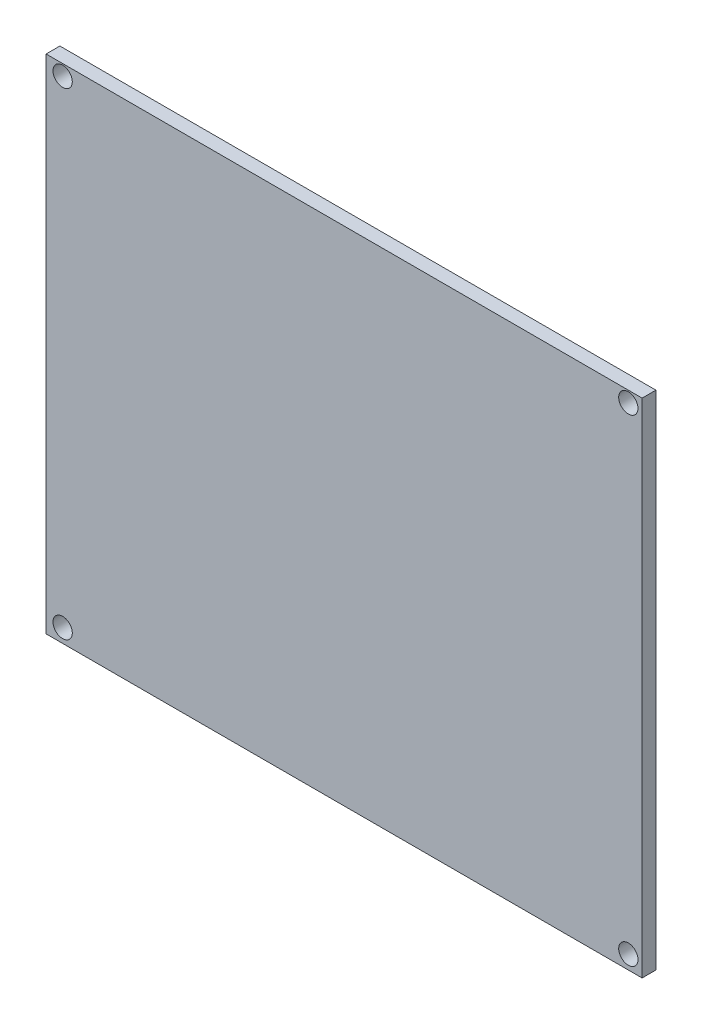
ISO-10303-21;
HEADER;
FILE_DESCRIPTION(('STEP AP214'),'2;1');
FILE_NAME('part.step','',(''),(''),'','','');
FILE_SCHEMA(('AUTOMOTIVE_DESIGN { 1 0 10303 214 1 1 1 1 }'));
ENDSEC;
DATA;
#1=APPLICATION_CONTEXT('core data for automotive mechanical design processes');
#2=APPLICATION_PROTOCOL_DEFINITION('international standard','automotive_design',2000,#1);
#3=PRODUCT_CONTEXT('',#1,'mechanical');
#4=PRODUCT('Part','Part','',(#3));
#5=PRODUCT_RELATED_PRODUCT_CATEGORY('part','',(#4));
#6=PRODUCT_DEFINITION_FORMATION('','',#4);
#7=PRODUCT_DEFINITION_CONTEXT('part definition',#1,'design');
#8=PRODUCT_DEFINITION('design','',#6,#7);
#9=PRODUCT_DEFINITION_SHAPE('','',#8);
#10=(LENGTH_UNIT() NAMED_UNIT(*) SI_UNIT(.MILLI.,.METRE.));
#11=(NAMED_UNIT(*) PLANE_ANGLE_UNIT() SI_UNIT($,.RADIAN.));
#12=(NAMED_UNIT(*) SI_UNIT($,.STERADIAN.) SOLID_ANGLE_UNIT());
#13=UNCERTAINTY_MEASURE_WITH_UNIT(LENGTH_MEASURE(1.E-05),#10,'distance_accuracy_value','');
#14=(GEOMETRIC_REPRESENTATION_CONTEXT(3) GLOBAL_UNCERTAINTY_ASSIGNED_CONTEXT((#13)) GLOBAL_UNIT_ASSIGNED_CONTEXT((#10,
#11,#12)) REPRESENTATION_CONTEXT('',''));
#15=CARTESIAN_POINT('',(0.,0.,0.));
#16=DIRECTION('',(0.,0.,1.));
#17=DIRECTION('',(1.,0.,0.));
#18=AXIS2_PLACEMENT_3D('',#15,#16,#17);
#19=CARTESIAN_POINT('',(-10.8173076923077,-26.1490384615385,5.));
#20=DIRECTION('',(1.,0.,0.));
#21=DIRECTION('',(0.,1.,0.));
#22=AXIS2_PLACEMENT_3D('',#19,#20,#21);
#23=PLANE('',#22);
#24=DIRECTION('',(0.,-1.,0.));
#25=VECTOR('',#24,1.);
#26=CARTESIAN_POINT('',(-10.8173076923077,-26.1490384615385,0.));
#27=LINE('',#26,#25);
#28=CARTESIAN_POINT('',(-10.8173076923077,-26.1490384615385,0.));
#29=VERTEX_POINT('',#28);
#30=CARTESIAN_POINT('',(-10.8173076923077,-208.149038461538,0.));
#31=VERTEX_POINT('',#30);
#32=EDGE_CURVE('E96',#29,#31,#27,.T.);
#33=ORIENTED_EDGE('',*,*,#32,.T.);
#34=DIRECTION('',(0.,0.,-1.));
#35=VECTOR('',#34,1.);
#36=CARTESIAN_POINT('',(-10.8173076923077,-208.149038461538,5.));
#37=LINE('',#36,#35);
#38=CARTESIAN_POINT('',(-10.8173076923077,-208.149038461538,5.));
#39=VERTEX_POINT('',#38);
#40=EDGE_CURVE('E11',#39,#31,#37,.T.);
#41=ORIENTED_EDGE('',*,*,#40,.F.);
#42=DIRECTION('',(0.,-1.,0.));
#43=VECTOR('',#42,1.);
#44=CARTESIAN_POINT('',(-10.8173076923077,-26.1490384615385,5.));
#45=LINE('',#44,#43);
#46=CARTESIAN_POINT('',(-10.8173076923077,-26.1490384615385,5.));
#47=VERTEX_POINT('',#46);
#48=EDGE_CURVE('E82',#47,#39,#45,.T.);
#49=ORIENTED_EDGE('',*,*,#48,.F.);
#50=DIRECTION('',(0.,0.,-1.));
#51=VECTOR('',#50,1.);
#52=CARTESIAN_POINT('',(-10.8173076923077,-26.1490384615385,5.));
#53=LINE('',#52,#51);
#54=EDGE_CURVE('E49',#47,#29,#53,.T.);
#55=ORIENTED_EDGE('',*,*,#54,.T.);
#56=EDGE_LOOP('',(#33,#41,#49,#55));
#57=FACE_BOUND('',#56,.T.);
#58=ADVANCED_FACE('F33',(#57),#23,.F.);
#59=CARTESIAN_POINT('',(-10.8173076923077,-208.149038461538,5.));
#60=DIRECTION('',(0.,1.,0.));
#61=DIRECTION('',(0.,0.,1.));
#62=AXIS2_PLACEMENT_3D('',#59,#60,#61);
#63=PLANE('',#62);
#64=DIRECTION('',(1.,0.,0.));
#65=VECTOR('',#64,1.);
#66=CARTESIAN_POINT('',(-10.8173076923077,-208.149038461538,0.));
#67=LINE('',#66,#65);
#68=CARTESIAN_POINT('',(205.182692307692,-208.149038461538,0.));
#69=VERTEX_POINT('',#68);
#70=EDGE_CURVE('E87',#31,#69,#67,.T.);
#71=ORIENTED_EDGE('',*,*,#70,.T.);
#72=DIRECTION('',(0.,0.,-1.));
#73=VECTOR('',#72,1.);
#74=CARTESIAN_POINT('',(205.182692307692,-208.149038461538,5.));
#75=LINE('',#74,#73);
#76=CARTESIAN_POINT('',(205.182692307692,-208.149038461538,5.));
#77=VERTEX_POINT('',#76);
#78=EDGE_CURVE('E41',#77,#69,#75,.T.);
#79=ORIENTED_EDGE('',*,*,#78,.F.);
#80=DIRECTION('',(1.,0.,0.));
#81=VECTOR('',#80,1.);
#82=CARTESIAN_POINT('',(-10.8173076923077,-208.149038461538,5.));
#83=LINE('',#82,#81);
#84=EDGE_CURVE('E74',#39,#77,#83,.T.);
#85=ORIENTED_EDGE('',*,*,#84,.F.);
#86=ORIENTED_EDGE('',*,*,#40,.T.);
#87=EDGE_LOOP('',(#71,#79,#85,#86));
#88=FACE_BOUND('',#87,.T.);
#89=ADVANCED_FACE('F86',(#88),#63,.F.);
#90=CARTESIAN_POINT('',(205.182692307692,-26.1490384615385,5.));
#91=DIRECTION('',(1.,0.,0.));
#92=DIRECTION('',(0.,1.,0.));
#93=AXIS2_PLACEMENT_3D('',#90,#91,#92);
#94=PLANE('',#93);
#95=DIRECTION('',(0.,-1.,0.));
#96=VECTOR('',#95,1.);
#97=CARTESIAN_POINT('',(205.182692307692,-26.1490384615385,0.));
#98=LINE('',#97,#96);
#99=CARTESIAN_POINT('',(205.182692307692,-26.1490384615385,0.));
#100=VERTEX_POINT('',#99);
#101=EDGE_CURVE('E100',#100,#69,#98,.T.);
#102=ORIENTED_EDGE('',*,*,#101,.F.);
#103=DIRECTION('',(0.,0.,-1.));
#104=VECTOR('',#103,1.);
#105=CARTESIAN_POINT('',(205.182692307692,-26.1490384615385,5.));
#106=LINE('',#105,#104);
#107=CARTESIAN_POINT('',(205.182692307692,-26.1490384615385,5.));
#108=VERTEX_POINT('',#107);
#109=EDGE_CURVE('E63',#108,#100,#106,.T.);
#110=ORIENTED_EDGE('',*,*,#109,.F.);
#111=DIRECTION('',(0.,-1.,0.));
#112=VECTOR('',#111,1.);
#113=CARTESIAN_POINT('',(205.182692307692,-26.1490384615385,5.));
#114=LINE('',#113,#112);
#115=EDGE_CURVE('E81',#108,#77,#114,.T.);
#116=ORIENTED_EDGE('',*,*,#115,.T.);
#117=ORIENTED_EDGE('',*,*,#78,.T.);
#118=EDGE_LOOP('',(#102,#110,#116,#117));
#119=FACE_BOUND('',#118,.T.);
#120=ADVANCED_FACE('F90',(#119),#94,.T.);
#121=CARTESIAN_POINT('',(-10.8173076923077,-26.1490384615385,5.));
#122=DIRECTION('',(0.,1.,0.));
#123=DIRECTION('',(0.,0.,1.));
#124=AXIS2_PLACEMENT_3D('',#121,#122,#123);
#125=PLANE('',#124);
#126=DIRECTION('',(1.,0.,0.));
#127=VECTOR('',#126,1.);
#128=CARTESIAN_POINT('',(-10.8173076923077,-26.1490384615385,0.));
#129=LINE('',#128,#127);
#130=EDGE_CURVE('E102',#29,#100,#129,.T.);
#131=ORIENTED_EDGE('',*,*,#130,.F.);
#132=ORIENTED_EDGE('',*,*,#54,.F.);
#133=DIRECTION('',(1.,0.,0.));
#134=VECTOR('',#133,1.);
#135=CARTESIAN_POINT('',(-10.8173076923077,-26.1490384615385,5.));
#136=LINE('',#135,#134);
#137=EDGE_CURVE('E91',#47,#108,#136,.T.);
#138=ORIENTED_EDGE('',*,*,#137,.T.);
#139=ORIENTED_EDGE('',*,*,#109,.T.);
#140=EDGE_LOOP('',(#131,#132,#138,#139));
#141=FACE_BOUND('',#140,.T.);
#142=ADVANCED_FACE('F145',(#141),#125,.T.);
#143=CARTESIAN_POINT('',(0.,0.,5.));
#144=DIRECTION('',(0.,0.,1.));
#145=DIRECTION('',(1.,0.,0.));
#146=AXIS2_PLACEMENT_3D('',#143,#144,#145);
#147=PLANE('',#146);
#148=CARTESIAN_POINT('',(200.182692307692,-30.1490384615385,5.));
#149=DIRECTION('',(0.,0.,1.));
#150=DIRECTION('',(1.,0.,0.));
#151=AXIS2_PLACEMENT_3D('',#148,#149,#150);
#152=CIRCLE('',#151,3.49999999999999);
#153=CARTESIAN_POINT('',(203.682692307692,-30.1490384615385,5.));
#154=VERTEX_POINT('',#153);
#155=EDGE_CURVE('E114',#154,#154,#152,.T.);
#156=ORIENTED_EDGE('',*,*,#155,.F.);
#157=EDGE_LOOP('',(#156));
#158=FACE_BOUND('',#157,.T.);
#159=CARTESIAN_POINT('',(-4.8173076923077,-30.1490384615385,5.));
#160=DIRECTION('',(0.,0.,1.));
#161=DIRECTION('',(1.,0.,0.));
#162=AXIS2_PLACEMENT_3D('',#159,#160,#161);
#163=CIRCLE('',#162,3.49999999999999);
#164=CARTESIAN_POINT('',(-1.31730769230771,-30.1490384615385,5.));
#165=VERTEX_POINT('',#164);
#166=EDGE_CURVE('E120',#165,#165,#163,.T.);
#167=ORIENTED_EDGE('',*,*,#166,.F.);
#168=EDGE_LOOP('',(#167));
#169=FACE_BOUND('',#168,.T.);
#170=CARTESIAN_POINT('',(-4.81730769230768,-203.149038461538,5.));
#171=DIRECTION('',(0.,0.,1.));
#172=DIRECTION('',(1.,0.,0.));
#173=AXIS2_PLACEMENT_3D('',#170,#171,#172);
#174=CIRCLE('',#173,3.49999999999999);
#175=CARTESIAN_POINT('',(-1.31730769230768,-203.149038461538,5.));
#176=VERTEX_POINT('',#175);
#177=EDGE_CURVE('E126',#176,#176,#174,.T.);
#178=ORIENTED_EDGE('',*,*,#177,.F.);
#179=EDGE_LOOP('',(#178));
#180=FACE_BOUND('',#179,.T.);
#181=CARTESIAN_POINT('',(200.182692307692,-203.149038461538,5.));
#182=DIRECTION('',(0.,0.,1.));
#183=DIRECTION('',(1.,0.,0.));
#184=AXIS2_PLACEMENT_3D('',#181,#182,#183);
#185=CIRCLE('',#184,3.49999999999999);
#186=CARTESIAN_POINT('',(203.682692307692,-203.149038461538,5.));
#187=VERTEX_POINT('',#186);
#188=EDGE_CURVE('E108',#187,#187,#185,.T.);
#189=ORIENTED_EDGE('',*,*,#188,.F.);
#190=EDGE_LOOP('',(#189));
#191=FACE_BOUND('',#190,.T.);
#192=ORIENTED_EDGE('',*,*,#48,.T.);
#193=ORIENTED_EDGE('',*,*,#84,.T.);
#194=ORIENTED_EDGE('',*,*,#115,.F.);
#195=ORIENTED_EDGE('',*,*,#137,.F.);
#196=EDGE_LOOP('',(#192,#193,#194,#195));
#197=FACE_BOUND('',#196,.T.);
#198=ADVANCED_FACE('F78',(#158,#169,#180,#191,#197),#147,.T.);
#199=CARTESIAN_POINT('',(0.,0.,0.));
#200=DIRECTION('',(0.,0.,1.));
#201=DIRECTION('',(1.,0.,0.));
#202=AXIS2_PLACEMENT_3D('',#199,#200,#201);
#203=PLANE('',#202);
#204=CARTESIAN_POINT('',(200.182692307692,-30.1490384615385,0.));
#205=DIRECTION('',(0.,0.,1.));
#206=DIRECTION('',(1.,0.,0.));
#207=AXIS2_PLACEMENT_3D('',#204,#205,#206);
#208=CIRCLE('',#207,3.49999999999999);
#209=CARTESIAN_POINT('',(203.682692307692,-30.1490384615385,0.));
#210=VERTEX_POINT('',#209);
#211=EDGE_CURVE('E117',#210,#210,#208,.T.);
#212=ORIENTED_EDGE('',*,*,#211,.T.);
#213=EDGE_LOOP('',(#212));
#214=FACE_BOUND('',#213,.T.);
#215=CARTESIAN_POINT('',(-4.8173076923077,-30.1490384615385,0.));
#216=DIRECTION('',(0.,0.,1.));
#217=DIRECTION('',(1.,0.,0.));
#218=AXIS2_PLACEMENT_3D('',#215,#216,#217);
#219=CIRCLE('',#218,3.49999999999999);
#220=CARTESIAN_POINT('',(-1.31730769230771,-30.1490384615385,0.));
#221=VERTEX_POINT('',#220);
#222=EDGE_CURVE('E123',#221,#221,#219,.T.);
#223=ORIENTED_EDGE('',*,*,#222,.T.);
#224=EDGE_LOOP('',(#223));
#225=FACE_BOUND('',#224,.T.);
#226=CARTESIAN_POINT('',(-4.81730769230768,-203.149038461538,0.));
#227=DIRECTION('',(0.,0.,1.));
#228=DIRECTION('',(1.,0.,0.));
#229=AXIS2_PLACEMENT_3D('',#226,#227,#228);
#230=CIRCLE('',#229,3.49999999999999);
#231=CARTESIAN_POINT('',(-1.31730769230768,-203.149038461538,0.));
#232=VERTEX_POINT('',#231);
#233=EDGE_CURVE('E111',#232,#232,#230,.T.);
#234=ORIENTED_EDGE('',*,*,#233,.T.);
#235=EDGE_LOOP('',(#234));
#236=FACE_BOUND('',#235,.T.);
#237=CARTESIAN_POINT('',(200.182692307692,-203.149038461538,0.));
#238=DIRECTION('',(0.,0.,1.));
#239=DIRECTION('',(1.,0.,0.));
#240=AXIS2_PLACEMENT_3D('',#237,#238,#239);
#241=CIRCLE('',#240,3.49999999999999);
#242=CARTESIAN_POINT('',(203.682692307692,-203.149038461538,0.));
#243=VERTEX_POINT('',#242);
#244=EDGE_CURVE('E98',#243,#243,#241,.T.);
#245=ORIENTED_EDGE('',*,*,#244,.T.);
#246=EDGE_LOOP('',(#245));
#247=FACE_BOUND('',#246,.T.);
#248=ORIENTED_EDGE('',*,*,#32,.F.);
#249=ORIENTED_EDGE('',*,*,#130,.T.);
#250=ORIENTED_EDGE('',*,*,#101,.T.);
#251=ORIENTED_EDGE('',*,*,#70,.F.);
#252=EDGE_LOOP('',(#248,#249,#250,#251));
#253=FACE_BOUND('',#252,.T.);
#254=ADVANCED_FACE('F132',(#214,#225,#236,#247,#253),#203,.F.);
#255=CARTESIAN_POINT('',(200.182692307692,-203.149038461538,0.));
#256=DIRECTION('',(0.,0.,1.));
#257=DIRECTION('',(1.,0.,0.));
#258=AXIS2_PLACEMENT_3D('',#255,#256,#257);
#259=CYLINDRICAL_SURFACE('',#258,3.49999999999999);
#260=ORIENTED_EDGE('',*,*,#244,.F.);
#261=EDGE_LOOP('',(#260));
#262=FACE_BOUND('',#261,.T.);
#263=ORIENTED_EDGE('',*,*,#188,.T.);
#264=EDGE_LOOP('',(#263));
#265=FACE_BOUND('',#264,.T.);
#266=ADVANCED_FACE('F139',(#262,#265),#259,.F.);
#267=CARTESIAN_POINT('',(-4.81730769230768,-203.149038461538,0.));
#268=DIRECTION('',(0.,0.,1.));
#269=DIRECTION('',(1.,0.,0.));
#270=AXIS2_PLACEMENT_3D('',#267,#268,#269);
#271=CYLINDRICAL_SURFACE('',#270,3.49999999999999);
#272=ORIENTED_EDGE('',*,*,#233,.F.);
#273=EDGE_LOOP('',(#272));
#274=FACE_BOUND('',#273,.T.);
#275=ORIENTED_EDGE('',*,*,#177,.T.);
#276=EDGE_LOOP('',(#275));
#277=FACE_BOUND('',#276,.T.);
#278=ADVANCED_FACE('F135',(#274,#277),#271,.F.);
#279=CARTESIAN_POINT('',(-4.8173076923077,-30.1490384615385,0.));
#280=DIRECTION('',(0.,0.,1.));
#281=DIRECTION('',(1.,0.,0.));
#282=AXIS2_PLACEMENT_3D('',#279,#280,#281);
#283=CYLINDRICAL_SURFACE('',#282,3.49999999999999);
#284=ORIENTED_EDGE('',*,*,#222,.F.);
#285=EDGE_LOOP('',(#284));
#286=FACE_BOUND('',#285,.T.);
#287=ORIENTED_EDGE('',*,*,#166,.T.);
#288=EDGE_LOOP('',(#287));
#289=FACE_BOUND('',#288,.T.);
#290=ADVANCED_FACE('F138',(#286,#289),#283,.F.);
#291=CARTESIAN_POINT('',(200.182692307692,-30.1490384615385,0.));
#292=DIRECTION('',(0.,0.,1.));
#293=DIRECTION('',(1.,0.,0.));
#294=AXIS2_PLACEMENT_3D('',#291,#292,#293);
#295=CYLINDRICAL_SURFACE('',#294,3.49999999999999);
#296=ORIENTED_EDGE('',*,*,#211,.F.);
#297=EDGE_LOOP('',(#296));
#298=FACE_BOUND('',#297,.T.);
#299=ORIENTED_EDGE('',*,*,#155,.T.);
#300=EDGE_LOOP('',(#299));
#301=FACE_BOUND('',#300,.T.);
#302=ADVANCED_FACE('F215',(#298,#301),#295,.F.);
#303=CLOSED_SHELL('',(#58,#89,#120,#142,#198,#254,#266,#278,#290,#302));
#304=MANIFOLD_SOLID_BREP('B2',#303);
#305=ADVANCED_BREP_SHAPE_REPRESENTATION('',(#18,#304),#14);
#306=SHAPE_DEFINITION_REPRESENTATION(#9,#305);
ENDSEC;
END-ISO-10303-21;
